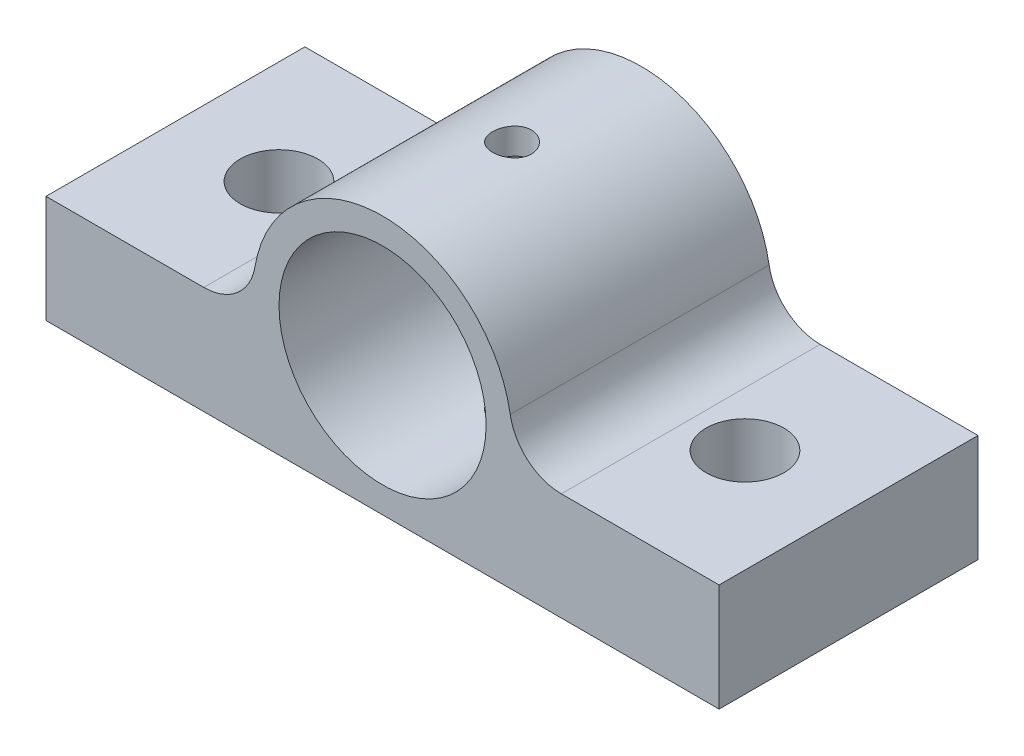
ISO-10303-21;
HEADER;
FILE_DESCRIPTION(('STEP AP214'),'2;1');
FILE_NAME('part.step','',(''),(''),'','','');
FILE_SCHEMA(('AUTOMOTIVE_DESIGN { 1 0 10303 214 1 1 1 1 }'));
ENDSEC;
DATA;
#1=APPLICATION_CONTEXT('core data for automotive mechanical design processes');
#2=APPLICATION_PROTOCOL_DEFINITION('international standard','automotive_design',2000,#1);
#3=PRODUCT_CONTEXT('',#1,'mechanical');
#4=PRODUCT('Part','Part','',(#3));
#5=PRODUCT_RELATED_PRODUCT_CATEGORY('part','',(#4));
#6=PRODUCT_DEFINITION_FORMATION('','',#4);
#7=PRODUCT_DEFINITION_CONTEXT('part definition',#1,'design');
#8=PRODUCT_DEFINITION('design','',#6,#7);
#9=PRODUCT_DEFINITION_SHAPE('','',#8);
#10=(LENGTH_UNIT() NAMED_UNIT(*) SI_UNIT(.MILLI.,.METRE.));
#11=(NAMED_UNIT(*) PLANE_ANGLE_UNIT() SI_UNIT($,.RADIAN.));
#12=(NAMED_UNIT(*) SI_UNIT($,.STERADIAN.) SOLID_ANGLE_UNIT());
#13=UNCERTAINTY_MEASURE_WITH_UNIT(LENGTH_MEASURE(1.E-05),#10,'distance_accuracy_value','');
#14=(GEOMETRIC_REPRESENTATION_CONTEXT(3) GLOBAL_UNCERTAINTY_ASSIGNED_CONTEXT((#13)) GLOBAL_UNIT_ASSIGNED_CONTEXT((#10,
#11,#12)) REPRESENTATION_CONTEXT('',''));
#15=CARTESIAN_POINT('',(0.,0.,0.));
#16=DIRECTION('',(0.,0.,1.));
#17=DIRECTION('',(1.,0.,0.));
#18=AXIS2_PLACEMENT_3D('',#15,#16,#17);
#19=CARTESIAN_POINT('',(0.,5.,10.));
#20=DIRECTION('',(0.,0.,-1.));
#21=DIRECTION('',(-1.,0.,0.));
#22=AXIS2_PLACEMENT_3D('',#19,#20,#21);
#23=CYLINDRICAL_SURFACE('',#22,5.);
#24=CARTESIAN_POINT('',(0.,10.,5.75));
#25=CARTESIAN_POINT('',(-0.041875772240821,9.99999932885648,5.74999827309238));
#26=CARTESIAN_POINT('',(-0.0837758425410658,9.9994684126852,5.74648099957968));
#27=CARTESIAN_POINT('',(-0.166404813997456,9.99740157986594,5.73250840000863));
#28=CARTESIAN_POINT('',(-0.207132534487114,9.99586468469237,5.72204631852755));
#29=CARTESIAN_POINT('',(-0.28620904311093,9.99195860609763,5.69450374751619));
#30=CARTESIAN_POINT('',(-0.324559603913399,9.9895900518546,5.67742826024703));
#31=CARTESIAN_POINT('',(-0.397845214317627,9.98428237955862,5.63715581029157));
#32=CARTESIAN_POINT('',(-0.432780737362594,9.98134334076386,5.61395969779132));
#33=CARTESIAN_POINT('',(-0.498523359781063,9.97519585495726,5.56191136753006));
#34=CARTESIAN_POINT('',(-0.52929991611275,9.97198566945166,5.5330207718959));
#35=CARTESIAN_POINT('',(-0.585587453344742,9.96567130566619,5.47048615555307));
#36=CARTESIAN_POINT('',(-0.611098131364678,9.96256713349253,5.43684186161074));
#37=CARTESIAN_POINT('',(-0.656248647499714,9.95679938729363,5.36554967823875));
#38=CARTESIAN_POINT('',(-0.675858935186025,9.95413805987515,5.32788287650933));
#39=CARTESIAN_POINT('',(-0.70846316085528,9.94958105653134,5.24974358967729));
#40=CARTESIAN_POINT('',(-0.721457459445815,9.94768533887724,5.20927125762805));
#41=CARTESIAN_POINT('',(-0.740365993994555,9.94489128109337,5.12699097906414));
#42=CARTESIAN_POINT('',(-0.746332518202588,9.94398557870625,5.08519530329599));
#43=CARTESIAN_POINT('',(-0.751178120169662,9.94325174485291,5.00118691700636));
#44=CARTESIAN_POINT('',(-0.750057604868981,9.94342355151573,4.95897423056875));
#45=CARTESIAN_POINT('',(-0.740803666253938,9.94481859176205,4.87569945990293));
#46=CARTESIAN_POINT('',(-0.732728479638752,9.94603309380775,4.8346307367576));
#47=CARTESIAN_POINT('',(-0.709885587018671,9.94936304063184,4.75443781556424));
#48=CARTESIAN_POINT('',(-0.69511769168906,9.9514785108969,4.71531367255963));
#49=CARTESIAN_POINT('',(-0.659248017648682,9.9563816777274,4.63994331435857));
#50=CARTESIAN_POINT('',(-0.638121571415988,9.95917198383263,4.60370901545381));
#51=CARTESIAN_POINT('',(-0.590152065644774,9.96510853787274,4.53527770210903));
#52=CARTESIAN_POINT('',(-0.563308630912391,9.9682548091625,4.50308095286532));
#53=CARTESIAN_POINT('',(-0.504347465391239,9.97458736528105,4.44330116963014));
#54=CARTESIAN_POINT('',(-0.472179664821001,9.97777373556407,4.41576750485683));
#55=CARTESIAN_POINT('',(-0.403653544947094,9.98379823824231,4.36648203274637));
#56=CARTESIAN_POINT('',(-0.367295207294085,9.98663636911255,4.34473025072805));
#57=CARTESIAN_POINT('',(-0.291377299106843,9.99164757792697,4.30762345675023));
#58=CARTESIAN_POINT('',(-0.25181583891839,9.99382025962714,4.29227225407985));
#59=CARTESIAN_POINT('',(-0.170636591243531,9.99725245278534,4.26844530515731));
#60=CARTESIAN_POINT('',(-0.129018942976301,9.99851202597734,4.25996909409221));
#61=CARTESIAN_POINT('',(-0.0453347838218235,9.99996790566936,4.25019838509165));
#62=CARTESIAN_POINT('',(-0.00327636593523549,10.0001742604519,4.24883601431034));
#63=CARTESIAN_POINT('',(0.080468338831141,9.99952780507613,4.25315150265551));
#64=CARTESIAN_POINT('',(0.122154637190938,9.99867502770684,4.25882914383405));
#65=CARTESIAN_POINT('',(0.203766193715704,9.99601234307667,4.27700705008877));
#66=CARTESIAN_POINT('',(0.243698981539919,9.99420707603992,4.28947424801542));
#67=CARTESIAN_POINT('',(0.320907479321499,9.98984117829184,4.32084249873088));
#68=CARTESIAN_POINT('',(0.358183064397549,9.98728051210783,4.33974385366682));
#69=CARTESIAN_POINT('',(0.42931748964596,9.98166341234343,4.38360311228193));
#70=CARTESIAN_POINT('',(0.463149504945783,9.97860350813373,4.40860407000639));
#71=CARTESIAN_POINT('',(0.526161836588853,9.97233931506083,4.46389290581437));
#72=CARTESIAN_POINT('',(0.555341882396701,9.96913501781434,4.49418109116233));
#73=CARTESIAN_POINT('',(0.608468924785977,9.96291132152247,4.55948676658825));
#74=CARTESIAN_POINT('',(0.632370423737105,9.95989368008794,4.59454146259738));
#75=CARTESIAN_POINT('',(0.67394564635292,9.95441609552452,4.66820802025588));
#76=CARTESIAN_POINT('',(0.691619538282178,9.95195613732814,4.70681978576073));
#77=CARTESIAN_POINT('',(0.720167336619717,9.94788516504322,4.78636876681156));
#78=CARTESIAN_POINT('',(0.731065185708177,9.94627116503219,4.82729723048562));
#79=CARTESIAN_POINT('',(0.745827747507932,9.94406691148901,4.91042950771755));
#80=CARTESIAN_POINT('',(0.749692945915332,9.94347658725885,4.95263323299734));
#81=CARTESIAN_POINT('',(0.750268933347199,9.94338916305421,5.03666453165789));
#82=CARTESIAN_POINT('',(0.747051260836563,9.94388113166751,5.07849162087846));
#83=CARTESIAN_POINT('',(0.733706147721894,9.94587910305587,5.16100263166176));
#84=CARTESIAN_POINT('',(0.723578718193135,9.94738510420559,5.2016865550567));
#85=CARTESIAN_POINT('',(0.696726867593326,9.95123763056149,5.28073654111716));
#86=CARTESIAN_POINT('',(0.68000744662157,9.95358351858038,5.31910433521672));
#87=CARTESIAN_POINT('',(0.640453338211545,9.95885227278851,5.3925018169012));
#88=CARTESIAN_POINT('',(0.61761844370751,9.96177515851362,5.42753139140182));
#89=CARTESIAN_POINT('',(0.56622168829582,9.96790371682469,5.49362152898759));
#90=CARTESIAN_POINT('',(0.537606845199028,9.97111183940983,5.52464066662353));
#91=CARTESIAN_POINT('',(0.475574420541418,9.97742894413318,5.58146227739391));
#92=CARTESIAN_POINT('',(0.442155724175471,9.98053790305379,5.60726353628808));
#93=CARTESIAN_POINT('',(0.371247853771861,9.9863259289526,5.65304383830368));
#94=CARTESIAN_POINT('',(0.333737288382381,9.9890025356441,5.67299005460737));
#95=CARTESIAN_POINT('',(0.25587593512436,9.9936001440148,5.70626925837902));
#96=CARTESIAN_POINT('',(0.215528138548353,9.99552192782878,5.71960909502684));
#97=CARTESIAN_POINT('',(0.145832863944665,9.99795469630753,5.73627067135505));
#98=CARTESIAN_POINT('',(0.11691556674764,9.99871774589778,5.74141130076941));
#99=CARTESIAN_POINT('',(0.0586694858000626,9.99974062973948,5.74827654885632));
#100=CARTESIAN_POINT('',(0.0293407071672086,10.0000004702439,5.75000120997627));
#101=CARTESIAN_POINT('',(0.,10.,5.75));
#102=B_SPLINE_CURVE_WITH_KNOTS('',3,(#24,#25,#26,#27,#28,#29,#30,#31,#32,#33,#34,#35,#36,#37,
#38,#39,#40,#41,#42,#43,#44,#45,#46,#47,#48,#49,#50,#51,#52,#53,#54,#55,#56,#57,#58,#59,#60,#61,
#62,#63,#64,#65,#66,#67,#68,#69,#70,#71,#72,#73,#74,#75,#76,#77,#78,#79,#80,#81,#82,#83,#84,#85,
#86,#87,#88,#89,#90,#91,#92,#93,#94,#95,#96,#97,#98,#99,#100,#101),.UNSPECIFIED.,.T.,.F.,(4,2,2,
2,2,2,2,2,2,2,2,2,2,2,2,2,2,2,2,2,2,2,2,2,2,2,2,2,2,2,2,2,2,2,2,2,2,2,4),(0.,0.125520102515832,
0.251162481464575,0.376710011791618,0.502240112098799,0.628647080684216,0.7550613178629,
0.882098511976875,1.00912878112753,1.13520782302962,1.26127962549491,1.38630588597873,
1.51133568345181,1.63685691738079,1.76238639154267,1.88917145627704,2.01595707619334,
2.14281804492437,2.269670435967,2.39531029272128,2.52094625995577,2.64597574482974,
2.77101110188137,2.89695594018454,3.02290810014315,3.14990683292336,3.27690213404416,
3.40344611728584,3.52998136068588,3.65524444130532,3.78050732114782,3.90567536992073,
4.0308476573344,4.1572241498286,4.28363001734366,4.41073161692366,4.5377011663072,
4.62564925989404,4.71359626061645),.UNSPECIFIED.);
#103=CARTESIAN_POINT('',(0.,10.,5.75));
#104=VERTEX_POINT('',#103);
#105=EDGE_CURVE('E230',#104,#104,#102,.T.);
#106=ORIENTED_EDGE('',*,*,#105,.T.);
#107=EDGE_LOOP('',(#106));
#108=FACE_BOUND('',#107,.T.);
#109=CARTESIAN_POINT('',(0.,5.,0.));
#110=DIRECTION('',(0.,0.,1.));
#111=DIRECTION('',(1.,0.,0.));
#112=AXIS2_PLACEMENT_3D('',#109,#110,#111);
#113=CIRCLE('',#112,5.);
#114=CARTESIAN_POINT('',(4.93147157535741,5.82497763693444,0.));
#115=VERTEX_POINT('',#114);
#116=CARTESIAN_POINT('',(-4.93147157535741,5.82497763693444,0.));
#117=VERTEX_POINT('',#116);
#118=EDGE_CURVE('E158',#115,#117,#113,.T.);
#119=ORIENTED_EDGE('',*,*,#118,.T.);
#120=DIRECTION('',(0.,0.,-1.));
#121=VECTOR('',#120,1.);
#122=CARTESIAN_POINT('',(-4.93147157535741,5.82497763693444,10.));
#123=LINE('',#122,#121);
#124=CARTESIAN_POINT('',(-4.93147157535741,5.82497763693444,10.));
#125=VERTEX_POINT('',#124);
#126=EDGE_CURVE('E11',#125,#117,#123,.T.);
#127=ORIENTED_EDGE('',*,*,#126,.F.);
#128=CARTESIAN_POINT('',(0.,5.,10.));
#129=DIRECTION('',(0.,0.,1.));
#130=DIRECTION('',(1.,0.,0.));
#131=AXIS2_PLACEMENT_3D('',#128,#129,#130);
#132=CIRCLE('',#131,5.);
#133=CARTESIAN_POINT('',(4.93147157535741,5.82497763693444,10.));
#134=VERTEX_POINT('',#133);
#135=EDGE_CURVE('E190',#134,#125,#132,.T.);
#136=ORIENTED_EDGE('',*,*,#135,.F.);
#137=DIRECTION('',(0.,0.,-1.));
#138=VECTOR('',#137,1.);
#139=CARTESIAN_POINT('',(4.93147157535741,5.82497763693444,10.));
#140=LINE('',#139,#138);
#141=EDGE_CURVE('E157',#134,#115,#140,.T.);
#142=ORIENTED_EDGE('',*,*,#141,.T.);
#143=EDGE_LOOP('',(#119,#127,#136,#142));
#144=FACE_BOUND('',#143,.T.);
#145=ADVANCED_FACE('F45',(#108,#144),#23,.T.);
#146=CARTESIAN_POINT('',(-6.90406020550037,6.15496869170822,10.));
#147=DIRECTION('',(0.,0.,-1.));
#148=DIRECTION('',(-1.,0.,0.));
#149=AXIS2_PLACEMENT_3D('',#146,#147,#148);
#150=CYLINDRICAL_SURFACE('',#149,2.);
#151=CARTESIAN_POINT('',(-6.90406020550037,6.15496869170822,0.));
#152=DIRECTION('',(0.,0.,1.));
#153=DIRECTION('',(1.,0.,0.));
#154=AXIS2_PLACEMENT_3D('',#151,#152,#153);
#155=CIRCLE('',#154,2.);
#156=CARTESIAN_POINT('',(-6.90406020550037,4.15496869170822,0.));
#157=VERTEX_POINT('',#156);
#158=EDGE_CURVE('E162',#117,#157,#155,.F.);
#159=ORIENTED_EDGE('',*,*,#158,.T.);
#160=DIRECTION('',(0.,0.,-1.));
#161=VECTOR('',#160,1.);
#162=CARTESIAN_POINT('',(-6.90406020550037,4.15496869170822,10.));
#163=LINE('',#162,#161);
#164=CARTESIAN_POINT('',(-6.90406020550037,4.15496869170822,10.));
#165=VERTEX_POINT('',#164);
#166=EDGE_CURVE('E61',#165,#157,#163,.T.);
#167=ORIENTED_EDGE('',*,*,#166,.F.);
#168=CARTESIAN_POINT('',(-6.90406020550037,6.15496869170822,10.));
#169=DIRECTION('',(0.,0.,1.));
#170=DIRECTION('',(1.,0.,0.));
#171=AXIS2_PLACEMENT_3D('',#168,#169,#170);
#172=CIRCLE('',#171,2.);
#173=EDGE_CURVE('E109',#125,#165,#172,.F.);
#174=ORIENTED_EDGE('',*,*,#173,.F.);
#175=ORIENTED_EDGE('',*,*,#126,.T.);
#176=EDGE_LOOP('',(#159,#167,#174,#175));
#177=FACE_BOUND('',#176,.T.);
#178=ADVANCED_FACE('F275',(#177),#150,.F.);
#179=CARTESIAN_POINT('',(0.,4.15496869170822,10.));
#180=DIRECTION('',(0.,1.,0.));
#181=DIRECTION('',(0.,0.,1.));
#182=AXIS2_PLACEMENT_3D('',#179,#180,#181);
#183=PLANE('',#182);
#184=CARTESIAN_POINT('',(-9.,4.15496869170822,5.));
#185=DIRECTION('',(0.,1.,0.));
#186=DIRECTION('',(0.,0.,1.));
#187=AXIS2_PLACEMENT_3D('',#184,#185,#186);
#188=CIRCLE('',#187,1.5);
#189=CARTESIAN_POINT('',(-9.,4.15496869170822,6.5));
#190=VERTEX_POINT('',#189);
#191=EDGE_CURVE('E239',#190,#190,#188,.T.);
#192=ORIENTED_EDGE('',*,*,#191,.F.);
#193=EDGE_LOOP('',(#192));
#194=FACE_BOUND('',#193,.T.);
#195=DIRECTION('',(1.,0.,0.));
#196=VECTOR('',#195,1.);
#197=CARTESIAN_POINT('',(0.,4.15496869170822,0.));
#198=LINE('',#197,#196);
#199=CARTESIAN_POINT('',(-13.,4.15496869170822,0.));
#200=VERTEX_POINT('',#199);
#201=EDGE_CURVE('E167',#200,#157,#198,.T.);
#202=ORIENTED_EDGE('',*,*,#201,.F.);
#203=DIRECTION('',(0.,0.,-1.));
#204=VECTOR('',#203,1.);
#205=CARTESIAN_POINT('',(-13.,4.15496869170822,10.));
#206=LINE('',#205,#204);
#207=CARTESIAN_POINT('',(-13.,4.15496869170822,10.));
#208=VERTEX_POINT('',#207);
#209=EDGE_CURVE('E200',#208,#200,#206,.T.);
#210=ORIENTED_EDGE('',*,*,#209,.F.);
#211=DIRECTION('',(1.,0.,0.));
#212=VECTOR('',#211,1.);
#213=CARTESIAN_POINT('',(0.,4.15496869170822,10.));
#214=LINE('',#213,#212);
#215=EDGE_CURVE('E253',#208,#165,#214,.T.);
#216=ORIENTED_EDGE('',*,*,#215,.T.);
#217=ORIENTED_EDGE('',*,*,#166,.T.);
#218=EDGE_LOOP('',(#202,#210,#216,#217));
#219=FACE_BOUND('',#218,.T.);
#220=ADVANCED_FACE('F280',(#194,#219),#183,.T.);
#221=CARTESIAN_POINT('',(-13.,0.,10.));
#222=DIRECTION('',(-1.,0.,0.));
#223=DIRECTION('',(0.,0.,1.));
#224=AXIS2_PLACEMENT_3D('',#221,#222,#223);
#225=PLANE('',#224);
#226=DIRECTION('',(0.,1.,0.));
#227=VECTOR('',#226,1.);
#228=CARTESIAN_POINT('',(-13.,0.,0.));
#229=LINE('',#228,#227);
#230=CARTESIAN_POINT('',(-13.,0.,0.));
#231=VERTEX_POINT('',#230);
#232=EDGE_CURVE('E171',#231,#200,#229,.T.);
#233=ORIENTED_EDGE('',*,*,#232,.F.);
#234=DIRECTION('',(0.,0.,-1.));
#235=VECTOR('',#234,1.);
#236=CARTESIAN_POINT('',(-13.,0.,10.));
#237=LINE('',#236,#235);
#238=CARTESIAN_POINT('',(-13.,0.,10.));
#239=VERTEX_POINT('',#238);
#240=EDGE_CURVE('E197',#239,#231,#237,.T.);
#241=ORIENTED_EDGE('',*,*,#240,.F.);
#242=DIRECTION('',(0.,1.,0.));
#243=VECTOR('',#242,1.);
#244=CARTESIAN_POINT('',(-13.,0.,10.));
#245=LINE('',#244,#243);
#246=EDGE_CURVE('E257',#239,#208,#245,.T.);
#247=ORIENTED_EDGE('',*,*,#246,.T.);
#248=ORIENTED_EDGE('',*,*,#209,.T.);
#249=EDGE_LOOP('',(#233,#241,#247,#248));
#250=FACE_BOUND('',#249,.T.);
#251=ADVANCED_FACE('F294',(#250),#225,.T.);
#252=CARTESIAN_POINT('',(0.,0.,10.));
#253=DIRECTION('',(0.,1.,0.));
#254=DIRECTION('',(0.,0.,1.));
#255=AXIS2_PLACEMENT_3D('',#252,#253,#254);
#256=PLANE('',#255);
#257=CARTESIAN_POINT('',(0.,0.,5.));
#258=DIRECTION('',(0.,1.,0.));
#259=DIRECTION('',(0.,0.,1.));
#260=AXIS2_PLACEMENT_3D('',#257,#258,#259);
#261=CIRCLE('',#260,0.75);
#262=CARTESIAN_POINT('',(0.,0.,5.75));
#263=VERTEX_POINT('',#262);
#264=EDGE_CURVE('E214',#263,#263,#261,.T.);
#265=ORIENTED_EDGE('',*,*,#264,.T.);
#266=EDGE_LOOP('',(#265));
#267=FACE_BOUND('',#266,.T.);
#268=CARTESIAN_POINT('',(-9.,0.,5.));
#269=DIRECTION('',(0.,1.,0.));
#270=DIRECTION('',(0.,0.,1.));
#271=AXIS2_PLACEMENT_3D('',#268,#269,#270);
#272=CIRCLE('',#271,1.5);
#273=CARTESIAN_POINT('',(-9.,0.,6.5));
#274=VERTEX_POINT('',#273);
#275=EDGE_CURVE('E163',#274,#274,#272,.T.);
#276=ORIENTED_EDGE('',*,*,#275,.T.);
#277=EDGE_LOOP('',(#276));
#278=FACE_BOUND('',#277,.T.);
#279=CARTESIAN_POINT('',(9.,0.,5.));
#280=DIRECTION('',(0.,1.,0.));
#281=DIRECTION('',(0.,0.,1.));
#282=AXIS2_PLACEMENT_3D('',#279,#280,#281);
#283=CIRCLE('',#282,1.5);
#284=CARTESIAN_POINT('',(9.,0.,6.5));
#285=VERTEX_POINT('',#284);
#286=EDGE_CURVE('E207',#285,#285,#283,.T.);
#287=ORIENTED_EDGE('',*,*,#286,.T.);
#288=EDGE_LOOP('',(#287));
#289=FACE_BOUND('',#288,.T.);
#290=DIRECTION('',(1.,0.,0.));
#291=VECTOR('',#290,1.);
#292=CARTESIAN_POINT('',(0.,0.,0.));
#293=LINE('',#292,#291);
#294=CARTESIAN_POINT('',(13.,0.,0.));
#295=VERTEX_POINT('',#294);
#296=EDGE_CURVE('E175',#231,#295,#293,.T.);
#297=ORIENTED_EDGE('',*,*,#296,.T.);
#298=DIRECTION('',(0.,0.,-1.));
#299=VECTOR('',#298,1.);
#300=CARTESIAN_POINT('',(13.,0.,10.));
#301=LINE('',#300,#299);
#302=CARTESIAN_POINT('',(13.,0.,10.));
#303=VERTEX_POINT('',#302);
#304=EDGE_CURVE('E135',#303,#295,#301,.T.);
#305=ORIENTED_EDGE('',*,*,#304,.F.);
#306=DIRECTION('',(1.,0.,0.));
#307=VECTOR('',#306,1.);
#308=CARTESIAN_POINT('',(0.,0.,10.));
#309=LINE('',#308,#307);
#310=EDGE_CURVE('E142',#239,#303,#309,.T.);
#311=ORIENTED_EDGE('',*,*,#310,.F.);
#312=ORIENTED_EDGE('',*,*,#240,.T.);
#313=EDGE_LOOP('',(#297,#305,#311,#312));
#314=FACE_BOUND('',#313,.T.);
#315=ADVANCED_FACE('F267',(#267,#278,#289,#314),#256,.F.);
#316=CARTESIAN_POINT('',(13.,0.,10.));
#317=DIRECTION('',(1.,0.,0.));
#318=DIRECTION('',(0.,0.,-1.));
#319=AXIS2_PLACEMENT_3D('',#316,#317,#318);
#320=PLANE('',#319);
#321=DIRECTION('',(0.,-1.,0.));
#322=VECTOR('',#321,1.);
#323=CARTESIAN_POINT('',(13.,0.,0.));
#324=LINE('',#323,#322);
#325=CARTESIAN_POINT('',(13.,4.15496869170822,0.));
#326=VERTEX_POINT('',#325);
#327=EDGE_CURVE('E129',#326,#295,#324,.T.);
#328=ORIENTED_EDGE('',*,*,#327,.F.);
#329=DIRECTION('',(0.,0.,-1.));
#330=VECTOR('',#329,1.);
#331=CARTESIAN_POINT('',(13.,4.15496869170822,10.));
#332=LINE('',#331,#330);
#333=CARTESIAN_POINT('',(13.,4.15496869170822,10.));
#334=VERTEX_POINT('',#333);
#335=EDGE_CURVE('E124',#334,#326,#332,.T.);
#336=ORIENTED_EDGE('',*,*,#335,.F.);
#337=DIRECTION('',(0.,-1.,0.));
#338=VECTOR('',#337,1.);
#339=CARTESIAN_POINT('',(13.,0.,10.));
#340=LINE('',#339,#338);
#341=EDGE_CURVE('E127',#334,#303,#340,.T.);
#342=ORIENTED_EDGE('',*,*,#341,.T.);
#343=ORIENTED_EDGE('',*,*,#304,.T.);
#344=EDGE_LOOP('',(#328,#336,#342,#343));
#345=FACE_BOUND('',#344,.T.);
#346=ADVANCED_FACE('F126',(#345),#320,.T.);
#347=CARTESIAN_POINT('',(0.,4.15496869170822,10.));
#348=DIRECTION('',(0.,1.,0.));
#349=DIRECTION('',(0.,0.,1.));
#350=AXIS2_PLACEMENT_3D('',#347,#348,#349);
#351=PLANE('',#350);
#352=CARTESIAN_POINT('',(9.,4.15496869170822,5.));
#353=DIRECTION('',(0.,1.,0.));
#354=DIRECTION('',(0.,0.,1.));
#355=AXIS2_PLACEMENT_3D('',#352,#353,#354);
#356=CIRCLE('',#355,1.5);
#357=CARTESIAN_POINT('',(9.,4.15496869170822,6.5));
#358=VERTEX_POINT('',#357);
#359=EDGE_CURVE('E238',#358,#358,#356,.T.);
#360=ORIENTED_EDGE('',*,*,#359,.F.);
#361=EDGE_LOOP('',(#360));
#362=FACE_BOUND('',#361,.T.);
#363=DIRECTION('',(1.,0.,0.));
#364=VECTOR('',#363,1.);
#365=CARTESIAN_POINT('',(0.,4.15496869170822,0.));
#366=LINE('',#365,#364);
#367=CARTESIAN_POINT('',(6.90406020550037,4.15496869170822,0.));
#368=VERTEX_POINT('',#367);
#369=EDGE_CURVE('E181',#368,#326,#366,.T.);
#370=ORIENTED_EDGE('',*,*,#369,.F.);
#371=DIRECTION('',(0.,0.,-1.));
#372=VECTOR('',#371,1.);
#373=CARTESIAN_POINT('',(6.90406020550037,4.15496869170822,10.));
#374=LINE('',#373,#372);
#375=CARTESIAN_POINT('',(6.90406020550037,4.15496869170822,10.));
#376=VERTEX_POINT('',#375);
#377=EDGE_CURVE('E98',#376,#368,#374,.T.);
#378=ORIENTED_EDGE('',*,*,#377,.F.);
#379=DIRECTION('',(1.,0.,0.));
#380=VECTOR('',#379,1.);
#381=CARTESIAN_POINT('',(0.,4.15496869170822,10.));
#382=LINE('',#381,#380);
#383=EDGE_CURVE('E139',#376,#334,#382,.T.);
#384=ORIENTED_EDGE('',*,*,#383,.T.);
#385=ORIENTED_EDGE('',*,*,#335,.T.);
#386=EDGE_LOOP('',(#370,#378,#384,#385));
#387=FACE_BOUND('',#386,.T.);
#388=ADVANCED_FACE('F146',(#362,#387),#351,.T.);
#389=CARTESIAN_POINT('',(6.90406020550037,6.15496869170822,10.));
#390=DIRECTION('',(0.,0.,-1.));
#391=DIRECTION('',(-1.,0.,0.));
#392=AXIS2_PLACEMENT_3D('',#389,#390,#391);
#393=CYLINDRICAL_SURFACE('',#392,2.);
#394=CARTESIAN_POINT('',(6.90406020550037,6.15496869170822,0.));
#395=DIRECTION('',(0.,0.,1.));
#396=DIRECTION('',(1.,0.,0.));
#397=AXIS2_PLACEMENT_3D('',#394,#395,#396);
#398=CIRCLE('',#397,2.);
#399=EDGE_CURVE('E101',#368,#115,#398,.F.);
#400=ORIENTED_EDGE('',*,*,#399,.T.);
#401=ORIENTED_EDGE('',*,*,#141,.F.);
#402=CARTESIAN_POINT('',(6.90406020550037,6.15496869170822,10.));
#403=DIRECTION('',(0.,0.,1.));
#404=DIRECTION('',(1.,0.,0.));
#405=AXIS2_PLACEMENT_3D('',#402,#403,#404);
#406=CIRCLE('',#405,2.);
#407=EDGE_CURVE('E70',#376,#134,#406,.F.);
#408=ORIENTED_EDGE('',*,*,#407,.F.);
#409=ORIENTED_EDGE('',*,*,#377,.T.);
#410=EDGE_LOOP('',(#400,#401,#408,#409));
#411=FACE_BOUND('',#410,.T.);
#412=ADVANCED_FACE('F330',(#411),#393,.F.);
#413=CARTESIAN_POINT('',(0.,5.,10.));
#414=DIRECTION('',(0.,0.,-1.));
#415=DIRECTION('',(-1.,0.,0.));
#416=AXIS2_PLACEMENT_3D('',#413,#414,#415);
#417=CYLINDRICAL_SURFACE('',#416,4.);
#418=CARTESIAN_POINT('',(0.,1.,5.75));
#419=CARTESIAN_POINT('',(0.0417358732327354,1.00000075583074,5.74999840520586));
#420=CARTESIAN_POINT('',(0.0834924963650493,1.00065995039143,5.74650446169031));
#421=CARTESIAN_POINT('',(0.165829064920899,1.0032260705474,5.73263000244083));
#422=CARTESIAN_POINT('',(0.206407987076113,1.00513404916552,5.72224367468013));
#423=CARTESIAN_POINT('',(0.2851864809259,1.00998430617271,5.69491364937033));
#424=CARTESIAN_POINT('',(0.323388165342672,1.01292565026759,5.67797587377373));
#425=CARTESIAN_POINT('',(0.396403986547003,1.01952144700108,5.63804056153859));
#426=CARTESIAN_POINT('',(0.431218397238661,1.02317584190855,5.61504351542759));
#427=CARTESIAN_POINT('',(0.496891857965251,1.03084331784748,5.56335011599816));
#428=CARTESIAN_POINT('',(0.527704477515916,1.03485982571824,5.53459527766493));
#429=CARTESIAN_POINT('',(0.584098030676846,1.04277340770675,5.47232834545622));
#430=CARTESIAN_POINT('',(0.609678588446207,1.04667047322736,5.43881591011536));
#431=CARTESIAN_POINT('',(0.655074993328964,1.05393724377497,5.36765695581802));
#432=CARTESIAN_POINT('',(0.674843609848027,1.05730253056909,5.32997981484138));
#433=CARTESIAN_POINT('',(0.707752621661416,1.06307643394006,5.25176554241161));
#434=CARTESIAN_POINT('',(0.720893588565491,1.06548513301519,5.21122865794439));
#435=CARTESIAN_POINT('',(0.740025267517501,1.06903865212725,5.12894238454279));
#436=CARTESIAN_POINT('',(0.746096950960195,1.07019777316798,5.08721245139827));
#437=CARTESIAN_POINT('',(0.751169040476732,1.07116401423619,5.00331130759588));
#438=CARTESIAN_POINT('',(0.75017008067687,1.0709712555062,4.96114013684885));
#439=CARTESIAN_POINT('',(0.741194898011812,1.06926853649124,4.87814023736698));
#440=CARTESIAN_POINT('',(0.733310749980224,1.06777595926333,4.83730114284992));
#441=CARTESIAN_POINT('',(0.710933996981034,1.06366908357667,4.7575357901087));
#442=CARTESIAN_POINT('',(0.696441111197496,1.06105473745242,4.71860961324535));
#443=CARTESIAN_POINT('',(0.661168235896499,1.05498072353706,4.64350566049987));
#444=CARTESIAN_POINT('',(0.640351067662279,1.05151608088317,4.6073457647096));
#445=CARTESIAN_POINT('',(0.593046844652081,1.04413514198541,4.53899763572988));
#446=CARTESIAN_POINT('',(0.56655921444633,1.04021879992239,4.5068098061426));
#447=CARTESIAN_POINT('',(0.508169528426488,1.03229999363918,4.44678752216377));
#448=CARTESIAN_POINT('',(0.476188718430341,1.02829714487985,4.41902967377413));
#449=CARTESIAN_POINT('',(0.407984018549413,1.02071306945841,4.3692613796623));
#450=CARTESIAN_POINT('',(0.371760086127884,1.01713184702377,4.34725099156479));
#451=CARTESIAN_POINT('',(0.296017494437334,1.01078730161246,4.30959112306499));
#452=CARTESIAN_POINT('',(0.256494782223247,1.00802500431856,4.29394961044105));
#453=CARTESIAN_POINT('',(0.175319557699348,1.0036374729864,4.26954895345392));
#454=CARTESIAN_POINT('',(0.133667272138893,1.00201211816003,4.26078907797732));
#455=CARTESIAN_POINT('',(0.0500743264516925,1.0000981967901,4.25050698449087));
#456=CARTESIAN_POINT('',(0.00814700631706762,0.999790245438607,4.24887980423514));
#457=CARTESIAN_POINT('',(-0.075380624046092,1.00049228200886,4.25262773977382));
#458=CARTESIAN_POINT('',(-0.116980950240193,1.00150220517784,4.25800251153263));
#459=CARTESIAN_POINT('',(-0.198340786609109,1.00471444249797,4.27551451759168));
#460=CARTESIAN_POINT('',(-0.238112130523031,1.00690738812985,4.28759864126891));
#461=CARTESIAN_POINT('',(-0.315064315912316,1.01224078893751,4.31812885338939));
#462=CARTESIAN_POINT('',(-0.352244981297551,1.01538130844333,4.33657537378289));
#463=CARTESIAN_POINT('',(-0.423408335756607,1.02230984821167,4.37953906407976));
#464=CARTESIAN_POINT('',(-0.457351638507561,1.02610456912719,4.40412036926842));
#465=CARTESIAN_POINT('',(-0.520669161632273,1.03390328255144,4.45856906868118));
#466=CARTESIAN_POINT('',(-0.550042954880433,1.03790729457656,4.48843695650067));
#467=CARTESIAN_POINT('',(-0.603786479360239,1.04573762151275,4.55308615945571));
#468=CARTESIAN_POINT('',(-0.628084581092883,1.04956087069872,4.58792745406269));
#469=CARTESIAN_POINT('',(-0.670483375288935,1.05653507210734,4.66125881226188));
#470=CARTESIAN_POINT('',(-0.688584298069621,1.05968604931325,4.69974874018524));
#471=CARTESIAN_POINT('',(-0.717973367564115,1.06493487895213,4.77910293362127));
#472=CARTESIAN_POINT('',(-0.729294343973931,1.06703779781561,4.81995468977967));
#473=CARTESIAN_POINT('',(-0.744903396631177,1.06996398098792,4.9030236112607));
#474=CARTESIAN_POINT('',(-0.749192266353541,1.07078738967105,4.9452406219852));
#475=CARTESIAN_POINT('',(-0.750588810741773,1.07105400098071,5.02912416572076));
#476=CARTESIAN_POINT('',(-0.747809475017494,1.07051892012853,5.0707887904785));
#477=CARTESIAN_POINT('',(-0.735395876894015,1.06817699670001,5.15304571102264));
#478=CARTESIAN_POINT('',(-0.72576165544666,1.06637016172127,5.19363801321372));
#479=CARTESIAN_POINT('',(-0.699959437916316,1.0616974598841,5.27253724239774));
#480=CARTESIAN_POINT('',(-0.683803676986262,1.05883357702518,5.31084829567288));
#481=CARTESIAN_POINT('',(-0.645429344561021,1.0523680622408,5.38423412712042));
#482=CARTESIAN_POINT('',(-0.623210344740928,1.0487663781994,5.41930867642239));
#483=CARTESIAN_POINT('',(-0.572947436697675,1.04116366946128,5.48579184002115));
#484=CARTESIAN_POINT('',(-0.544821299321517,1.03715747323478,5.51713770628355));
#485=CARTESIAN_POINT('',(-0.483713963371145,1.02923583040632,5.57470258123226));
#486=CARTESIAN_POINT('',(-0.450731650945808,1.02532040486336,5.60092041049007));
#487=CARTESIAN_POINT('',(-0.380492472535936,1.01798012015976,5.64770547631353));
#488=CARTESIAN_POINT('',(-0.343199795320257,1.0145599950472,5.66821971424532));
#489=CARTESIAN_POINT('',(-0.265645056826916,1.00864190309657,5.70265881830257));
#490=CARTESIAN_POINT('',(-0.225385825852623,1.00614307060481,5.71658987352346));
#491=CARTESIAN_POINT('',(-0.154173601412576,1.00285854646184,5.73463865720934));
#492=CARTESIAN_POINT('',(-0.123636905125935,1.00179264560897,5.7403893151564));
#493=CARTESIAN_POINT('',(-0.0620706235575788,1.00036310022995,5.74807053105822));
#494=CARTESIAN_POINT('',(-0.0310410508263547,0.999999437850975,5.75000118612795));
#495=CARTESIAN_POINT('',(0.,1.,5.75));
#496=B_SPLINE_CURVE_WITH_KNOTS('',3,(#418,#419,#420,#421,#422,#423,#424,#425,#426,#427,#428,
#429,#430,#431,#432,#433,#434,#435,#436,#437,#438,#439,#440,#441,#442,#443,#444,#445,#446,#447,
#448,#449,#450,#451,#452,#453,#454,#455,#456,#457,#458,#459,#460,#461,#462,#463,#464,#465,#466,
#467,#468,#469,#470,#471,#472,#473,#474,#475,#476,#477,#478,#479,#480,#481,#482,#483,#484,#485,
#486,#487,#488,#489,#490,#491,#492,#493,#494,#495),.UNSPECIFIED.,.T.,.F.,(4,2,2,2,2,2,2,2,2,2,2,
2,2,2,2,2,2,2,2,2,2,2,2,2,2,2,2,2,2,2,2,2,2,2,2,2,2,2,4),(0.,0.125094100482462,
0.250293821267726,0.375380635615453,0.500457326684454,0.626875590068152,0.753302931418083,
0.880730952521788,1.00814798155974,1.13409075722668,1.26002223793628,1.38429500306383,
1.50857304923393,1.63359631314765,1.7586322702493,1.88563884232038,2.01264668772474,
2.13981294160849,2.26696568336873,2.39224087038048,2.51750990232292,2.64180116953914,
2.76610087669016,2.89175889008854,3.01742864206549,3.14476718493649,3.27210099477473,
3.39881313909279,3.52551098473256,3.65019626115874,3.77488079270753,3.89933248103846,
4.02379296327711,4.1501168498319,4.27646975631128,4.40396024458157,4.53133063465587,
4.62437172262205,4.7174104451977),.UNSPECIFIED.);
#497=CARTESIAN_POINT('',(0.,1.,5.75));
#498=VERTEX_POINT('',#497);
#499=EDGE_CURVE('E49',#498,#498,#496,.T.);
#500=ORIENTED_EDGE('',*,*,#499,.F.);
#501=EDGE_LOOP('',(#500));
#502=FACE_BOUND('',#501,.T.);
#503=CARTESIAN_POINT('',(0.,9.,5.75));
#504=CARTESIAN_POINT('',(-0.0417358732327354,8.99999924416926,5.74999840520586));
#505=CARTESIAN_POINT('',(-0.0834924963650493,8.99934004960857,5.74650446169031));
#506=CARTESIAN_POINT('',(-0.165829064920899,8.9967739294526,5.73263000244083));
#507=CARTESIAN_POINT('',(-0.206407987076113,8.99486595083448,5.72224367468013));
#508=CARTESIAN_POINT('',(-0.2851864809259,8.99001569382729,5.69491364937033));
#509=CARTESIAN_POINT('',(-0.323388165342672,8.98707434973242,5.67797587377373));
#510=CARTESIAN_POINT('',(-0.396403986547003,8.98047855299892,5.63804056153859));
#511=CARTESIAN_POINT('',(-0.431218397238661,8.97682415809145,5.61504351542759));
#512=CARTESIAN_POINT('',(-0.496891857965251,8.96915668215252,5.56335011599816));
#513=CARTESIAN_POINT('',(-0.527704477515916,8.96514017428176,5.53459527766493));
#514=CARTESIAN_POINT('',(-0.584098030676846,8.95722659229325,5.47232834545622));
#515=CARTESIAN_POINT('',(-0.609678588446207,8.95332952677264,5.43881591011536));
#516=CARTESIAN_POINT('',(-0.655074993328964,8.94606275622503,5.36765695581802));
#517=CARTESIAN_POINT('',(-0.674843609848026,8.94269746943091,5.32997981484138));
#518=CARTESIAN_POINT('',(-0.707752621661415,8.93692356605994,5.25176554241161));
#519=CARTESIAN_POINT('',(-0.720893588565491,8.93451486698481,5.21122865794439));
#520=CARTESIAN_POINT('',(-0.7400252675175,8.93096134787275,5.1289423845428));
#521=CARTESIAN_POINT('',(-0.746096950960195,8.92980222683202,5.08721245139827));
#522=CARTESIAN_POINT('',(-0.751169040476732,8.92883598576381,5.00331130759588));
#523=CARTESIAN_POINT('',(-0.75017008067687,8.9290287444938,4.96114013684885));
#524=CARTESIAN_POINT('',(-0.741194898011812,8.93073146350876,4.87814023736698));
#525=CARTESIAN_POINT('',(-0.733310749980224,8.93222404073667,4.83730114284992));
#526=CARTESIAN_POINT('',(-0.710933996981035,8.93633091642333,4.7575357901087));
#527=CARTESIAN_POINT('',(-0.696441111197496,8.93894526254758,4.71860961324535));
#528=CARTESIAN_POINT('',(-0.661168235896499,8.94501927646294,4.64350566049987));
#529=CARTESIAN_POINT('',(-0.640351067662279,8.94848391911683,4.6073457647096));
#530=CARTESIAN_POINT('',(-0.593046844652081,8.95586485801459,4.53899763572988));
#531=CARTESIAN_POINT('',(-0.56655921444633,8.95978120007761,4.5068098061426));
#532=CARTESIAN_POINT('',(-0.508169528426489,8.96770000636082,4.44678752216377));
#533=CARTESIAN_POINT('',(-0.476188718430342,8.97170285512015,4.41902967377413));
#534=CARTESIAN_POINT('',(-0.407984018549414,8.97928693054159,4.3692613796623));
#535=CARTESIAN_POINT('',(-0.371760086127885,8.98286815297623,4.34725099156479));
#536=CARTESIAN_POINT('',(-0.296017494437334,8.98921269838754,4.30959112306499));
#537=CARTESIAN_POINT('',(-0.256494782223247,8.99197499568145,4.29394961044105));
#538=CARTESIAN_POINT('',(-0.175319557699349,8.9963625270136,4.26954895345392));
#539=CARTESIAN_POINT('',(-0.133667272138894,8.99798788183997,4.26078907797732));
#540=CARTESIAN_POINT('',(-0.0500743264516927,8.9999018032099,4.25050698449087));
#541=CARTESIAN_POINT('',(-0.00814700631706769,9.00020975456139,4.24887980423514));
#542=CARTESIAN_POINT('',(0.0753806240460919,8.99950771799114,4.25262773977382));
#543=CARTESIAN_POINT('',(0.116980950240192,8.99849779482216,4.25800251153263));
#544=CARTESIAN_POINT('',(0.198340786609108,8.99528555750203,4.27551451759168));
#545=CARTESIAN_POINT('',(0.238112130523031,8.99309261187015,4.28759864126891));
#546=CARTESIAN_POINT('',(0.315064315912316,8.98775921106249,4.31812885338939));
#547=CARTESIAN_POINT('',(0.352244981297551,8.98461869155667,4.33657537378289));
#548=CARTESIAN_POINT('',(0.423408335756607,8.97769015178833,4.37953906407976));
#549=CARTESIAN_POINT('',(0.45735163850756,8.97389543087281,4.40412036926842));
#550=CARTESIAN_POINT('',(0.520669161632272,8.96609671744856,4.45856906868118));
#551=CARTESIAN_POINT('',(0.550042954880433,8.96209270542344,4.48843695650067));
#552=CARTESIAN_POINT('',(0.603786479360239,8.95426237848725,4.55308615945571));
#553=CARTESIAN_POINT('',(0.628084581092883,8.95043912930128,4.58792745406269));
#554=CARTESIAN_POINT('',(0.670483375288934,8.94346492789266,4.66125881226188));
#555=CARTESIAN_POINT('',(0.68858429806962,8.94031395068675,4.69974874018524));
#556=CARTESIAN_POINT('',(0.717973367564115,8.93506512104787,4.77910293362127));
#557=CARTESIAN_POINT('',(0.729294343973931,8.93296220218439,4.81995468977967));
#558=CARTESIAN_POINT('',(0.744903396631177,8.93003601901207,4.9030236112607));
#559=CARTESIAN_POINT('',(0.749192266353541,8.92921261032895,4.9452406219852));
#560=CARTESIAN_POINT('',(0.750588810741773,8.92894599901929,5.02912416572076));
#561=CARTESIAN_POINT('',(0.747809475017494,8.92948107987147,5.0707887904785));
#562=CARTESIAN_POINT('',(0.735395876894015,8.93182300329999,5.15304571102264));
#563=CARTESIAN_POINT('',(0.72576165544666,8.93362983827874,5.19363801321372));
#564=CARTESIAN_POINT('',(0.699959437916316,8.9383025401159,5.27253724239774));
#565=CARTESIAN_POINT('',(0.683803676986263,8.94116642297482,5.31084829567288));
#566=CARTESIAN_POINT('',(0.645429344561022,8.9476319377592,5.38423412712042));
#567=CARTESIAN_POINT('',(0.623210344740929,8.9512336218006,5.41930867642239));
#568=CARTESIAN_POINT('',(0.572947436697675,8.95883633053873,5.48579184002115));
#569=CARTESIAN_POINT('',(0.544821299321517,8.96284252676522,5.51713770628355));
#570=CARTESIAN_POINT('',(0.483713963371145,8.97076416959368,5.57470258123226));
#571=CARTESIAN_POINT('',(0.450731650945808,8.97467959513664,5.60092041049007));
#572=CARTESIAN_POINT('',(0.380492472535937,8.98201987984024,5.64770547631353));
#573=CARTESIAN_POINT('',(0.343199795320259,8.98544000495281,5.66821971424532));
#574=CARTESIAN_POINT('',(0.265645056826917,8.99135809690343,5.70265881830257));
#575=CARTESIAN_POINT('',(0.225385825852624,8.99385692939519,5.71658987352346));
#576=CARTESIAN_POINT('',(0.154173601412577,8.99714145353816,5.73463865720934));
#577=CARTESIAN_POINT('',(0.123636905125935,8.99820735439103,5.7403893151564));
#578=CARTESIAN_POINT('',(0.0620706235575789,8.99963689977005,5.74807053105822));
#579=CARTESIAN_POINT('',(0.0310410508263547,9.00000056214903,5.75000118612795));
#580=CARTESIAN_POINT('',(0.,9.,5.75));
#581=B_SPLINE_CURVE_WITH_KNOTS('',3,(#503,#504,#505,#506,#507,#508,#509,#510,#511,#512,#513,
#514,#515,#516,#517,#518,#519,#520,#521,#522,#523,#524,#525,#526,#527,#528,#529,#530,#531,#532,
#533,#534,#535,#536,#537,#538,#539,#540,#541,#542,#543,#544,#545,#546,#547,#548,#549,#550,#551,
#552,#553,#554,#555,#556,#557,#558,#559,#560,#561,#562,#563,#564,#565,#566,#567,#568,#569,#570,
#571,#572,#573,#574,#575,#576,#577,#578,#579,#580),.UNSPECIFIED.,.T.,.F.,(4,2,2,2,2,2,2,2,2,2,2,
2,2,2,2,2,2,2,2,2,2,2,2,2,2,2,2,2,2,2,2,2,2,2,2,2,2,2,4),(0.,0.125094100482462,
0.250293821267726,0.375380635615453,0.500457326684454,0.626875590068152,0.753302931418083,
0.880730952521787,1.00814798155974,1.13409075722668,1.26002223793628,1.38429500306383,
1.50857304923393,1.63359631314765,1.7586322702493,1.88563884232038,2.01264668772474,
2.13981294160849,2.26696568336873,2.39224087038048,2.51750990232292,2.64180116953914,
2.76610087669016,2.89175889008854,3.01742864206549,3.14476718493649,3.27210099477472,
3.39881313909279,3.52551098473256,3.65019626115874,3.77488079270753,3.89933248103846,
4.02379296327711,4.1501168498319,4.27646975631128,4.40396024458157,4.53133063465587,
4.62437172262205,4.7174104451977),.UNSPECIFIED.);
#582=CARTESIAN_POINT('',(0.,9.,5.75));
#583=VERTEX_POINT('',#582);
#584=EDGE_CURVE('E208',#583,#583,#581,.T.);
#585=ORIENTED_EDGE('',*,*,#584,.F.);
#586=EDGE_LOOP('',(#585));
#587=FACE_BOUND('',#586,.T.);
#588=CARTESIAN_POINT('',(0.,5.,10.));
#589=DIRECTION('',(0.,0.,1.));
#590=DIRECTION('',(1.,0.,0.));
#591=AXIS2_PLACEMENT_3D('',#588,#589,#590);
#592=CIRCLE('',#591,4.);
#593=CARTESIAN_POINT('',(4.,5.,10.));
#594=VERTEX_POINT('',#593);
#595=EDGE_CURVE('E150',#594,#594,#592,.T.);
#596=ORIENTED_EDGE('',*,*,#595,.T.);
#597=EDGE_LOOP('',(#596));
#598=FACE_BOUND('',#597,.T.);
#599=CARTESIAN_POINT('',(0.,5.,0.));
#600=DIRECTION('',(0.,0.,1.));
#601=DIRECTION('',(1.,0.,0.));
#602=AXIS2_PLACEMENT_3D('',#599,#600,#601);
#603=CIRCLE('',#602,4.);
#604=CARTESIAN_POINT('',(4.,5.,0.));
#605=VERTEX_POINT('',#604);
#606=EDGE_CURVE('E186',#605,#605,#603,.T.);
#607=ORIENTED_EDGE('',*,*,#606,.F.);
#608=EDGE_LOOP('',(#607));
#609=FACE_BOUND('',#608,.T.);
#610=ADVANCED_FACE('F215',(#502,#587,#598,#609),#417,.F.);
#611=CARTESIAN_POINT('',(0.,0.,10.));
#612=DIRECTION('',(0.,0.,1.));
#613=DIRECTION('',(1.,0.,0.));
#614=AXIS2_PLACEMENT_3D('',#611,#612,#613);
#615=PLANE('',#614);
#616=ORIENTED_EDGE('',*,*,#135,.T.);
#617=ORIENTED_EDGE('',*,*,#173,.T.);
#618=ORIENTED_EDGE('',*,*,#215,.F.);
#619=ORIENTED_EDGE('',*,*,#246,.F.);
#620=ORIENTED_EDGE('',*,*,#310,.T.);
#621=ORIENTED_EDGE('',*,*,#341,.F.);
#622=ORIENTED_EDGE('',*,*,#383,.F.);
#623=ORIENTED_EDGE('',*,*,#407,.T.);
#624=EDGE_LOOP('',(#616,#617,#618,#619,#620,#621,#622,#623));
#625=FACE_BOUND('',#624,.T.);
#626=ORIENTED_EDGE('',*,*,#595,.F.);
#627=EDGE_LOOP('',(#626));
#628=FACE_BOUND('',#627,.T.);
#629=ADVANCED_FACE('F137',(#625,#628),#615,.T.);
#630=CARTESIAN_POINT('',(0.,0.,0.));
#631=DIRECTION('',(0.,0.,1.));
#632=DIRECTION('',(1.,0.,0.));
#633=AXIS2_PLACEMENT_3D('',#630,#631,#632);
#634=PLANE('',#633);
#635=ORIENTED_EDGE('',*,*,#118,.F.);
#636=ORIENTED_EDGE('',*,*,#399,.F.);
#637=ORIENTED_EDGE('',*,*,#369,.T.);
#638=ORIENTED_EDGE('',*,*,#327,.T.);
#639=ORIENTED_EDGE('',*,*,#296,.F.);
#640=ORIENTED_EDGE('',*,*,#232,.T.);
#641=ORIENTED_EDGE('',*,*,#201,.T.);
#642=ORIENTED_EDGE('',*,*,#158,.F.);
#643=EDGE_LOOP('',(#635,#636,#637,#638,#639,#640,#641,#642));
#644=FACE_BOUND('',#643,.T.);
#645=ORIENTED_EDGE('',*,*,#606,.T.);
#646=EDGE_LOOP('',(#645));
#647=FACE_BOUND('',#646,.T.);
#648=ADVANCED_FACE('F287',(#644,#647),#634,.F.);
#649=CARTESIAN_POINT('',(9.,-5.84503130829178,5.));
#650=DIRECTION('',(0.,1.,0.));
#651=DIRECTION('',(0.,0.,1.));
#652=AXIS2_PLACEMENT_3D('',#649,#650,#651);
#653=CYLINDRICAL_SURFACE('',#652,1.5);
#654=ORIENTED_EDGE('',*,*,#359,.T.);
#655=EDGE_LOOP('',(#654));
#656=FACE_BOUND('',#655,.T.);
#657=ORIENTED_EDGE('',*,*,#286,.F.);
#658=EDGE_LOOP('',(#657));
#659=FACE_BOUND('',#658,.T.);
#660=ADVANCED_FACE('F315',(#656,#659),#653,.F.);
#661=CARTESIAN_POINT('',(-9.,-5.84503130829178,5.));
#662=DIRECTION('',(0.,1.,0.));
#663=DIRECTION('',(0.,0.,1.));
#664=AXIS2_PLACEMENT_3D('',#661,#662,#663);
#665=CYLINDRICAL_SURFACE('',#664,1.5);
#666=ORIENTED_EDGE('',*,*,#191,.T.);
#667=EDGE_LOOP('',(#666));
#668=FACE_BOUND('',#667,.T.);
#669=ORIENTED_EDGE('',*,*,#275,.F.);
#670=EDGE_LOOP('',(#669));
#671=FACE_BOUND('',#670,.T.);
#672=ADVANCED_FACE('F224',(#668,#671),#665,.F.);
#673=CARTESIAN_POINT('',(0.,0.,5.));
#674=DIRECTION('',(0.,1.,0.));
#675=DIRECTION('',(0.,0.,1.));
#676=AXIS2_PLACEMENT_3D('',#673,#674,#675);
#677=CYLINDRICAL_SURFACE('',#676,0.75);
#678=ORIENTED_EDGE('',*,*,#584,.T.);
#679=EDGE_LOOP('',(#678));
#680=FACE_BOUND('',#679,.T.);
#681=ORIENTED_EDGE('',*,*,#105,.F.);
#682=EDGE_LOOP('',(#681));
#683=FACE_BOUND('',#682,.T.);
#684=ADVANCED_FACE('F219',(#680,#683),#677,.F.);
#685=ORIENTED_EDGE('',*,*,#499,.T.);
#686=EDGE_LOOP('',(#685));
#687=FACE_BOUND('',#686,.T.);
#688=ORIENTED_EDGE('',*,*,#264,.F.);
#689=EDGE_LOOP('',(#688));
#690=FACE_BOUND('',#689,.T.);
#691=ADVANCED_FACE('F223',(#687,#690),#677,.F.);
#692=CLOSED_SHELL('',(#145,#178,#220,#251,#315,#346,#388,#412,#610,#629,#648,#660,#672,#684,#691));
#693=MANIFOLD_SOLID_BREP('B2',#692);
#694=ADVANCED_BREP_SHAPE_REPRESENTATION('',(#18,#693),#14);
#695=SHAPE_DEFINITION_REPRESENTATION(#9,#694);
ENDSEC;
END-ISO-10303-21;
